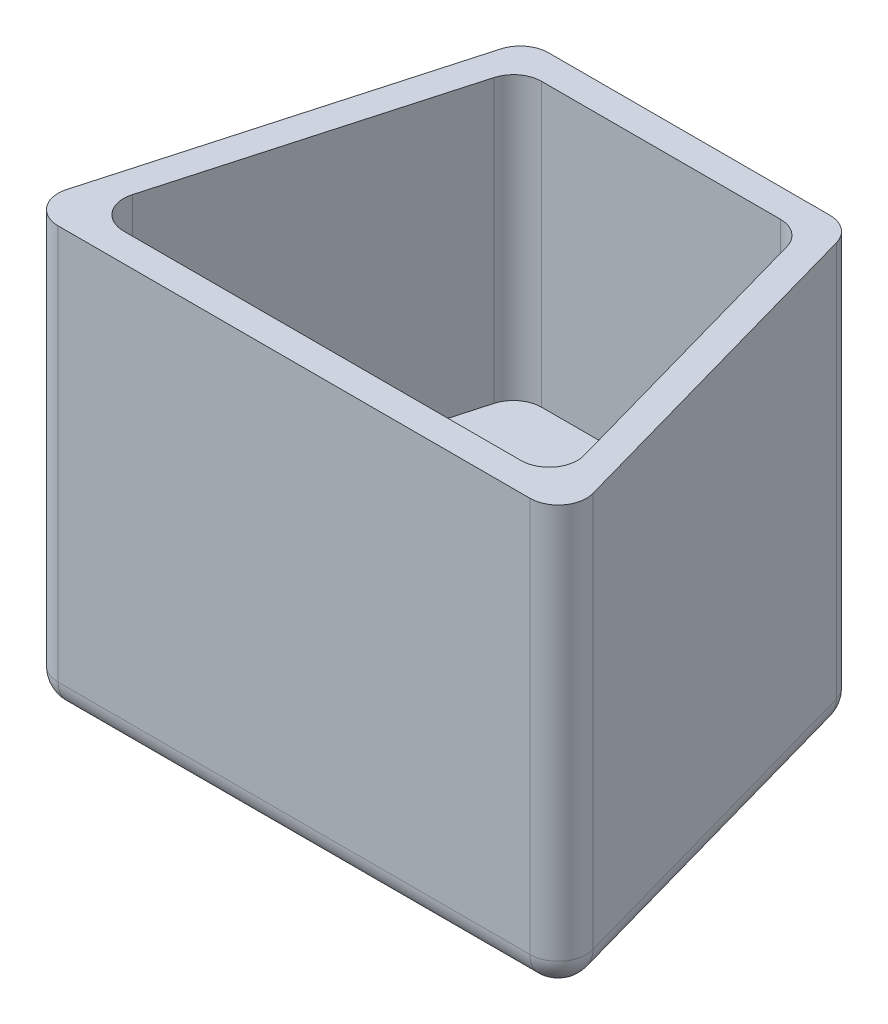
ISO-10303-21;
HEADER;
FILE_DESCRIPTION(('STEP AP214'),'2;1');
FILE_NAME('part.step','',(''),(''),'','','');
FILE_SCHEMA(('AUTOMOTIVE_DESIGN { 1 0 10303 214 1 1 1 1 }'));
ENDSEC;
DATA;
#1=APPLICATION_CONTEXT('core data for automotive mechanical design processes');
#2=APPLICATION_PROTOCOL_DEFINITION('international standard','automotive_design',2000,#1);
#3=PRODUCT_CONTEXT('',#1,'mechanical');
#4=PRODUCT('Part','Part','',(#3));
#5=PRODUCT_RELATED_PRODUCT_CATEGORY('part','',(#4));
#6=PRODUCT_DEFINITION_FORMATION('','',#4);
#7=PRODUCT_DEFINITION_CONTEXT('part definition',#1,'design');
#8=PRODUCT_DEFINITION('design','',#6,#7);
#9=PRODUCT_DEFINITION_SHAPE('','',#8);
#10=(LENGTH_UNIT() NAMED_UNIT(*) SI_UNIT(.MILLI.,.METRE.));
#11=(NAMED_UNIT(*) PLANE_ANGLE_UNIT() SI_UNIT($,.RADIAN.));
#12=(NAMED_UNIT(*) SI_UNIT($,.STERADIAN.) SOLID_ANGLE_UNIT());
#13=UNCERTAINTY_MEASURE_WITH_UNIT(LENGTH_MEASURE(1.E-05),#10,'distance_accuracy_value','');
#14=(GEOMETRIC_REPRESENTATION_CONTEXT(3) GLOBAL_UNCERTAINTY_ASSIGNED_CONTEXT((#13)) GLOBAL_UNIT_ASSIGNED_CONTEXT((#10,
#11,#12)) REPRESENTATION_CONTEXT('',''));
#15=CARTESIAN_POINT('',(0.,0.,0.));
#16=DIRECTION('',(0.,0.,1.));
#17=DIRECTION('',(1.,0.,0.));
#18=AXIS2_PLACEMENT_3D('',#15,#16,#17);
#19=CARTESIAN_POINT('',(-7.0398555990135,15.,5.));
#20=DIRECTION('',(0.,-1.,0.));
#21=DIRECTION('',(0.,0.,-1.));
#22=AXIS2_PLACEMENT_3D('',#19,#20,#21);
#23=CYLINDRICAL_SURFACE('',#22,1.);
#24=DIRECTION('',(0.,-1.,0.));
#25=VECTOR('',#24,1.);
#26=CARTESIAN_POINT('',(-7.03985559901349,15.,6.));
#27=LINE('',#26,#25);
#28=CARTESIAN_POINT('',(-7.03985559901349,15.,6.));
#29=VERTEX_POINT('',#28);
#30=CARTESIAN_POINT('',(-7.03985559901349,5.,6.));
#31=VERTEX_POINT('',#30);
#32=EDGE_CURVE('E185',#29,#31,#27,.T.);
#33=ORIENTED_EDGE('',*,*,#32,.T.);
#34=CARTESIAN_POINT('',(-7.0398555990135,5.,5.));
#35=DIRECTION('',(0.,-1.,0.));
#36=DIRECTION('',(0.,0.,-1.));
#37=AXIS2_PLACEMENT_3D('',#34,#35,#36);
#38=CIRCLE('',#37,1.);
#39=CARTESIAN_POINT('',(-8.0025065391674,5.,4.72925442308171));
#40=VERTEX_POINT('',#39);
#41=EDGE_CURVE('E167',#31,#40,#38,.T.);
#42=ORIENTED_EDGE('',*,*,#41,.T.);
#43=DIRECTION('',(0.,-1.,0.));
#44=VECTOR('',#43,1.);
#45=CARTESIAN_POINT('',(-8.0025065391674,15.,4.72925442308171));
#46=LINE('',#45,#44);
#47=CARTESIAN_POINT('',(-8.0025065391674,15.,4.72925442308171));
#48=VERTEX_POINT('',#47);
#49=EDGE_CURVE('E176',#48,#40,#46,.T.);
#50=ORIENTED_EDGE('',*,*,#49,.F.);
#51=CARTESIAN_POINT('',(-7.0398555990135,15.,5.));
#52=DIRECTION('',(0.,1.,0.));
#53=DIRECTION('',(0.,0.,1.));
#54=AXIS2_PLACEMENT_3D('',#51,#52,#53);
#55=CIRCLE('',#54,1.);
#56=EDGE_CURVE('E181',#48,#29,#55,.T.);
#57=ORIENTED_EDGE('',*,*,#56,.T.);
#58=EDGE_LOOP('',(#33,#42,#50,#57));
#59=FACE_BOUND('',#58,.T.);
#60=ADVANCED_FACE('F40',(#59),#23,.F.);
#61=CARTESIAN_POINT('',(-7.03985559901349,15.,6.));
#62=DIRECTION('',(0.,0.,-1.));
#63=DIRECTION('',(-1.,0.,0.));
#64=AXIS2_PLACEMENT_3D('',#61,#62,#63);
#65=PLANE('',#64);
#66=DIRECTION('',(0.,-1.,0.));
#67=VECTOR('',#66,1.);
#68=CARTESIAN_POINT('',(7.03985559901349,15.,6.));
#69=LINE('',#68,#67);
#70=CARTESIAN_POINT('',(7.03985559901349,15.,6.));
#71=VERTEX_POINT('',#70);
#72=CARTESIAN_POINT('',(7.03985559901349,5.,6.));
#73=VERTEX_POINT('',#72);
#74=EDGE_CURVE('E208',#71,#73,#69,.T.);
#75=ORIENTED_EDGE('',*,*,#74,.T.);
#76=DIRECTION('',(-1.,0.,0.));
#77=VECTOR('',#76,1.);
#78=CARTESIAN_POINT('',(-7.03985559901349,5.,6.));
#79=LINE('',#78,#77);
#80=EDGE_CURVE('E184',#73,#31,#79,.T.);
#81=ORIENTED_EDGE('',*,*,#80,.T.);
#82=ORIENTED_EDGE('',*,*,#32,.F.);
#83=DIRECTION('',(1.,0.,0.));
#84=VECTOR('',#83,1.);
#85=CARTESIAN_POINT('',(-7.03985559901349,15.,6.));
#86=LINE('',#85,#84);
#87=EDGE_CURVE('E312',#29,#71,#86,.T.);
#88=ORIENTED_EDGE('',*,*,#87,.T.);
#89=EDGE_LOOP('',(#75,#81,#82,#88));
#90=FACE_BOUND('',#89,.T.);
#91=ADVANCED_FACE('F334',(#90),#65,.T.);
#92=CARTESIAN_POINT('',(7.0398555990135,15.,5.));
#93=DIRECTION('',(0.,-1.,0.));
#94=DIRECTION('',(0.,0.,-1.));
#95=AXIS2_PLACEMENT_3D('',#92,#93,#94);
#96=CYLINDRICAL_SURFACE('',#95,1.);
#97=DIRECTION('',(0.,-1.,0.));
#98=VECTOR('',#97,1.);
#99=CARTESIAN_POINT('',(8.0025065391674,15.,4.72925442308171));
#100=LINE('',#99,#98);
#101=CARTESIAN_POINT('',(8.0025065391674,15.,4.72925442308171));
#102=VERTEX_POINT('',#101);
#103=CARTESIAN_POINT('',(8.0025065391674,5.,4.72925442308171));
#104=VERTEX_POINT('',#103);
#105=EDGE_CURVE('E202',#102,#104,#100,.T.);
#106=ORIENTED_EDGE('',*,*,#105,.T.);
#107=CARTESIAN_POINT('',(7.0398555990135,5.,5.));
#108=DIRECTION('',(0.,-1.,0.));
#109=DIRECTION('',(0.,0.,-1.));
#110=AXIS2_PLACEMENT_3D('',#107,#108,#109);
#111=CIRCLE('',#110,1.);
#112=EDGE_CURVE('E309',#104,#73,#111,.T.);
#113=ORIENTED_EDGE('',*,*,#112,.T.);
#114=ORIENTED_EDGE('',*,*,#74,.F.);
#115=CARTESIAN_POINT('',(7.0398555990135,15.,5.));
#116=DIRECTION('',(0.,1.,0.));
#117=DIRECTION('',(0.,0.,-1.));
#118=AXIS2_PLACEMENT_3D('',#115,#116,#117);
#119=CIRCLE('',#118,1.);
#120=EDGE_CURVE('E320',#71,#102,#119,.T.);
#121=ORIENTED_EDGE('',*,*,#120,.T.);
#122=EDGE_LOOP('',(#106,#113,#114,#121));
#123=FACE_BOUND('',#122,.T.);
#124=ADVANCED_FACE('F336',(#123),#96,.F.);
#125=CARTESIAN_POINT('',(5.1900065391674,15.,-5.27074557691828));
#126=DIRECTION('',(-0.962650940153899,0.,0.270745576918284));
#127=DIRECTION('',(0.270745576918284,0.,0.962650940153899));
#128=AXIS2_PLACEMENT_3D('',#125,#126,#127);
#129=PLANE('',#128);
#130=DIRECTION('',(0.,-1.,0.));
#131=VECTOR('',#130,1.);
#132=CARTESIAN_POINT('',(5.1900065391674,15.,-5.27074557691828));
#133=LINE('',#132,#131);
#134=CARTESIAN_POINT('',(5.1900065391674,15.,-5.27074557691828));
#135=VERTEX_POINT('',#134);
#136=CARTESIAN_POINT('',(5.1900065391674,5.,-5.27074557691828));
#137=VERTEX_POINT('',#136);
#138=EDGE_CURVE('E205',#135,#137,#133,.T.);
#139=ORIENTED_EDGE('',*,*,#138,.T.);
#140=DIRECTION('',(0.270745576918284,0.,0.962650940153899));
#141=VECTOR('',#140,1.);
#142=CARTESIAN_POINT('',(5.1900065391674,5.,-5.27074557691828));
#143=LINE('',#142,#141);
#144=EDGE_CURVE('E307',#137,#104,#143,.T.);
#145=ORIENTED_EDGE('',*,*,#144,.T.);
#146=ORIENTED_EDGE('',*,*,#105,.F.);
#147=DIRECTION('',(-0.270745576918284,0.,-0.962650940153899));
#148=VECTOR('',#147,1.);
#149=CARTESIAN_POINT('',(5.1900065391674,15.,-5.27074557691828));
#150=LINE('',#149,#148);
#151=EDGE_CURVE('E317',#102,#135,#150,.T.);
#152=ORIENTED_EDGE('',*,*,#151,.T.);
#153=EDGE_LOOP('',(#139,#145,#146,#152));
#154=FACE_BOUND('',#153,.T.);
#155=ADVANCED_FACE('F339',(#154),#129,.T.);
#156=CARTESIAN_POINT('',(4.2273555990135,15.,-5.));
#157=DIRECTION('',(0.,-1.,0.));
#158=DIRECTION('',(0.,0.,-1.));
#159=AXIS2_PLACEMENT_3D('',#156,#157,#158);
#160=CYLINDRICAL_SURFACE('',#159,1.);
#161=DIRECTION('',(0.,-1.,0.));
#162=VECTOR('',#161,1.);
#163=CARTESIAN_POINT('',(4.22735559901349,15.,-6.));
#164=LINE('',#163,#162);
#165=CARTESIAN_POINT('',(4.22735559901349,15.,-6.));
#166=VERTEX_POINT('',#165);
#167=CARTESIAN_POINT('',(4.22735559901349,5.,-6.));
#168=VERTEX_POINT('',#167);
#169=EDGE_CURVE('E200',#166,#168,#164,.T.);
#170=ORIENTED_EDGE('',*,*,#169,.T.);
#171=CARTESIAN_POINT('',(4.2273555990135,5.,-5.));
#172=DIRECTION('',(0.,-1.,0.));
#173=DIRECTION('',(0.,0.,-1.));
#174=AXIS2_PLACEMENT_3D('',#171,#172,#173);
#175=CIRCLE('',#174,1.);
#176=EDGE_CURVE('E305',#168,#137,#175,.T.);
#177=ORIENTED_EDGE('',*,*,#176,.T.);
#178=ORIENTED_EDGE('',*,*,#138,.F.);
#179=CARTESIAN_POINT('',(4.2273555990135,15.,-5.));
#180=DIRECTION('',(0.,1.,0.));
#181=DIRECTION('',(0.,0.,1.));
#182=AXIS2_PLACEMENT_3D('',#179,#180,#181);
#183=CIRCLE('',#182,1.);
#184=EDGE_CURVE('E321',#135,#166,#183,.T.);
#185=ORIENTED_EDGE('',*,*,#184,.T.);
#186=EDGE_LOOP('',(#170,#177,#178,#185));
#187=FACE_BOUND('',#186,.T.);
#188=ADVANCED_FACE('F343',(#187),#160,.F.);
#189=CARTESIAN_POINT('',(-4.22735559901349,15.,-6.));
#190=DIRECTION('',(0.,0.,1.));
#191=DIRECTION('',(1.,0.,0.));
#192=AXIS2_PLACEMENT_3D('',#189,#190,#191);
#193=PLANE('',#192);
#194=DIRECTION('',(0.,-1.,0.));
#195=VECTOR('',#194,1.);
#196=CARTESIAN_POINT('',(-4.22735559901349,15.,-6.));
#197=LINE('',#196,#195);
#198=CARTESIAN_POINT('',(-4.22735559901349,15.,-6.));
#199=VERTEX_POINT('',#198);
#200=CARTESIAN_POINT('',(-4.2273555990135,5.,-6.));
#201=VERTEX_POINT('',#200);
#202=EDGE_CURVE('E192',#199,#201,#197,.T.);
#203=ORIENTED_EDGE('',*,*,#202,.T.);
#204=DIRECTION('',(1.,0.,0.));
#205=VECTOR('',#204,1.);
#206=CARTESIAN_POINT('',(-4.22735559901349,5.,-6.));
#207=LINE('',#206,#205);
#208=EDGE_CURVE('E300',#201,#168,#207,.T.);
#209=ORIENTED_EDGE('',*,*,#208,.T.);
#210=ORIENTED_EDGE('',*,*,#169,.F.);
#211=DIRECTION('',(-1.,0.,0.));
#212=VECTOR('',#211,1.);
#213=CARTESIAN_POINT('',(-4.22735559901349,15.,-6.));
#214=LINE('',#213,#212);
#215=EDGE_CURVE('E323',#166,#199,#214,.T.);
#216=ORIENTED_EDGE('',*,*,#215,.T.);
#217=EDGE_LOOP('',(#203,#209,#210,#216));
#218=FACE_BOUND('',#217,.T.);
#219=ADVANCED_FACE('F350',(#218),#193,.T.);
#220=CARTESIAN_POINT('',(-4.2273555990135,15.,-5.));
#221=DIRECTION('',(0.,-1.,0.));
#222=DIRECTION('',(0.,0.,-1.));
#223=AXIS2_PLACEMENT_3D('',#220,#221,#222);
#224=CYLINDRICAL_SURFACE('',#223,1.);
#225=DIRECTION('',(0.,-1.,0.));
#226=VECTOR('',#225,1.);
#227=CARTESIAN_POINT('',(-5.1900065391674,15.,-5.27074557691828));
#228=LINE('',#227,#226);
#229=CARTESIAN_POINT('',(-5.1900065391674,15.,-5.27074557691828));
#230=VERTEX_POINT('',#229);
#231=CARTESIAN_POINT('',(-5.1900065391674,5.,-5.27074557691828));
#232=VERTEX_POINT('',#231);
#233=EDGE_CURVE('E188',#230,#232,#228,.T.);
#234=ORIENTED_EDGE('',*,*,#233,.T.);
#235=CARTESIAN_POINT('',(-4.2273555990135,5.,-5.));
#236=DIRECTION('',(0.,-1.,0.));
#237=DIRECTION('',(0.,0.,-1.));
#238=AXIS2_PLACEMENT_3D('',#235,#236,#237);
#239=CIRCLE('',#238,1.);
#240=EDGE_CURVE('E166',#232,#201,#239,.T.);
#241=ORIENTED_EDGE('',*,*,#240,.T.);
#242=ORIENTED_EDGE('',*,*,#202,.F.);
#243=CARTESIAN_POINT('',(-4.2273555990135,15.,-5.));
#244=DIRECTION('',(0.,1.,0.));
#245=DIRECTION('',(0.,0.,1.));
#246=AXIS2_PLACEMENT_3D('',#243,#244,#245);
#247=CIRCLE('',#246,1.);
#248=EDGE_CURVE('E194',#199,#230,#247,.T.);
#249=ORIENTED_EDGE('',*,*,#248,.T.);
#250=EDGE_LOOP('',(#234,#241,#242,#249));
#251=FACE_BOUND('',#250,.T.);
#252=ADVANCED_FACE('F326',(#251),#224,.F.);
#253=CARTESIAN_POINT('',(-5.1900065391674,15.,-5.27074557691828));
#254=DIRECTION('',(0.962650940153899,0.,0.270745576918284));
#255=DIRECTION('',(0.270745576918284,0.,-0.962650940153899));
#256=AXIS2_PLACEMENT_3D('',#253,#254,#255);
#257=PLANE('',#256);
#258=ORIENTED_EDGE('',*,*,#49,.T.);
#259=DIRECTION('',(0.270745576918284,0.,-0.962650940153899));
#260=VECTOR('',#259,1.);
#261=CARTESIAN_POINT('',(-5.1900065391674,5.,-5.27074557691828));
#262=LINE('',#261,#260);
#263=EDGE_CURVE('E162',#40,#232,#262,.T.);
#264=ORIENTED_EDGE('',*,*,#263,.T.);
#265=ORIENTED_EDGE('',*,*,#233,.F.);
#266=DIRECTION('',(-0.270745576918284,0.,0.962650940153899));
#267=VECTOR('',#266,1.);
#268=CARTESIAN_POINT('',(-5.1900065391674,15.,-5.27074557691828));
#269=LINE('',#268,#267);
#270=EDGE_CURVE('E187',#230,#48,#269,.T.);
#271=ORIENTED_EDGE('',*,*,#270,.T.);
#272=EDGE_LOOP('',(#258,#264,#265,#271));
#273=FACE_BOUND('',#272,.T.);
#274=ADVANCED_FACE('F186',(#273),#257,.T.);
#275=CARTESIAN_POINT('',(-8.35990373267567,15.,6.));
#276=DIRECTION('',(0.,-1.,0.));
#277=DIRECTION('',(0.,0.,-1.));
#278=AXIS2_PLACEMENT_3D('',#275,#276,#277);
#279=PLANE('',#278);
#280=CARTESIAN_POINT('',(-8.35990373267567,15.,6.));
#281=DIRECTION('',(0.,1.,0.));
#282=DIRECTION('',(0.,0.,-1.));
#283=AXIS2_PLACEMENT_3D('',#280,#281,#282);
#284=CIRCLE('',#283,1.);
#285=CARTESIAN_POINT('',(-9.32255467282957,15.,5.72925442308172));
#286=VERTEX_POINT('',#285);
#287=CARTESIAN_POINT('',(-8.35990373267567,15.,7.));
#288=VERTEX_POINT('',#287);
#289=EDGE_CURVE('E215',#286,#288,#284,.T.);
#290=ORIENTED_EDGE('',*,*,#289,.T.);
#291=DIRECTION('',(1.,0.,0.));
#292=VECTOR('',#291,1.);
#293=CARTESIAN_POINT('',(-8.35990373267567,15.,7.));
#294=LINE('',#293,#292);
#295=CARTESIAN_POINT('',(8.35990373267567,15.,7.));
#296=VERTEX_POINT('',#295);
#297=EDGE_CURVE('E214',#288,#296,#294,.T.);
#298=ORIENTED_EDGE('',*,*,#297,.T.);
#299=CARTESIAN_POINT('',(8.35990373267567,15.,6.));
#300=DIRECTION('',(0.,1.,0.));
#301=DIRECTION('',(0.,0.,1.));
#302=AXIS2_PLACEMENT_3D('',#299,#300,#301);
#303=CIRCLE('',#302,1.);
#304=CARTESIAN_POINT('',(9.32255467282956,15.,5.72925442308172));
#305=VERTEX_POINT('',#304);
#306=EDGE_CURVE('E220',#296,#305,#303,.T.);
#307=ORIENTED_EDGE('',*,*,#306,.T.);
#308=DIRECTION('',(-0.270745576918284,0.,-0.962650940153899));
#309=VECTOR('',#308,1.);
#310=CARTESIAN_POINT('',(5.94755467282956,15.,-6.27074557691828));
#311=LINE('',#310,#309);
#312=CARTESIAN_POINT('',(5.94755467282956,15.,-6.27074557691828));
#313=VERTEX_POINT('',#312);
#314=EDGE_CURVE('E218',#305,#313,#311,.T.);
#315=ORIENTED_EDGE('',*,*,#314,.T.);
#316=CARTESIAN_POINT('',(4.98490373267567,15.,-6.));
#317=DIRECTION('',(0.,1.,0.));
#318=DIRECTION('',(0.,0.,-1.));
#319=AXIS2_PLACEMENT_3D('',#316,#317,#318);
#320=CIRCLE('',#319,0.999999999999998);
#321=CARTESIAN_POINT('',(4.98490373267567,15.,-7.));
#322=VERTEX_POINT('',#321);
#323=EDGE_CURVE('E222',#313,#322,#320,.T.);
#324=ORIENTED_EDGE('',*,*,#323,.T.);
#325=DIRECTION('',(-1.,0.,0.));
#326=VECTOR('',#325,1.);
#327=CARTESIAN_POINT('',(-4.98490373267567,15.,-7.));
#328=LINE('',#327,#326);
#329=CARTESIAN_POINT('',(-4.98490373267567,15.,-7.));
#330=VERTEX_POINT('',#329);
#331=EDGE_CURVE('E224',#322,#330,#328,.T.);
#332=ORIENTED_EDGE('',*,*,#331,.T.);
#333=CARTESIAN_POINT('',(-4.98490373267567,15.,-6.));
#334=DIRECTION('',(0.,1.,0.));
#335=DIRECTION('',(0.,0.,1.));
#336=AXIS2_PLACEMENT_3D('',#333,#334,#335);
#337=CIRCLE('',#336,0.999999999999999);
#338=CARTESIAN_POINT('',(-5.94755467282956,15.,-6.27074557691828));
#339=VERTEX_POINT('',#338);
#340=EDGE_CURVE('E223',#330,#339,#337,.T.);
#341=ORIENTED_EDGE('',*,*,#340,.T.);
#342=DIRECTION('',(-0.270745576918284,0.,0.962650940153899));
#343=VECTOR('',#342,1.);
#344=CARTESIAN_POINT('',(-5.94755467282956,15.,-6.27074557691828));
#345=LINE('',#344,#343);
#346=EDGE_CURVE('E230',#339,#286,#345,.T.);
#347=ORIENTED_EDGE('',*,*,#346,.T.);
#348=EDGE_LOOP('',(#290,#298,#307,#315,#324,#332,#341,#347));
#349=FACE_BOUND('',#348,.T.);
#350=ORIENTED_EDGE('',*,*,#56,.F.);
#351=ORIENTED_EDGE('',*,*,#270,.F.);
#352=ORIENTED_EDGE('',*,*,#248,.F.);
#353=ORIENTED_EDGE('',*,*,#215,.F.);
#354=ORIENTED_EDGE('',*,*,#184,.F.);
#355=ORIENTED_EDGE('',*,*,#151,.F.);
#356=ORIENTED_EDGE('',*,*,#120,.F.);
#357=ORIENTED_EDGE('',*,*,#87,.F.);
#358=EDGE_LOOP('',(#350,#351,#352,#353,#354,#355,#356,#357));
#359=FACE_BOUND('',#358,.T.);
#360=ADVANCED_FACE('F328',(#349,#359),#279,.F.);
#361=CARTESIAN_POINT('',(-8.35990373267567,0.,6.));
#362=DIRECTION('',(0.,-1.,0.));
#363=DIRECTION('',(0.,0.,-1.));
#364=AXIS2_PLACEMENT_3D('',#361,#362,#363);
#365=PLANE('',#364);
#366=DIRECTION('',(1.,0.,0.));
#367=VECTOR('',#366,1.);
#368=CARTESIAN_POINT('',(-8.35990373267567,0.,6.));
#369=LINE('',#368,#367);
#370=CARTESIAN_POINT('',(8.35990373267567,0.,6.));
#371=VERTEX_POINT('',#370);
#372=CARTESIAN_POINT('',(-8.35990373267567,0.,6.));
#373=VERTEX_POINT('',#372);
#374=EDGE_CURVE('E251',#371,#373,#369,.F.);
#375=ORIENTED_EDGE('',*,*,#374,.T.);
#376=DIRECTION('',(-0.270745576918284,0.,0.962650940153899));
#377=VECTOR('',#376,1.);
#378=CARTESIAN_POINT('',(-4.98490373267566,0.,-6.));
#379=LINE('',#378,#377);
#380=CARTESIAN_POINT('',(-4.98490373267567,0.,-6.));
#381=VERTEX_POINT('',#380);
#382=EDGE_CURVE('E259',#373,#381,#379,.F.);
#383=ORIENTED_EDGE('',*,*,#382,.T.);
#384=DIRECTION('',(-1.,0.,0.));
#385=VECTOR('',#384,1.);
#386=CARTESIAN_POINT('',(4.98490373267567,0.,-6.));
#387=LINE('',#386,#385);
#388=CARTESIAN_POINT('',(4.98490373267566,0.,-6.));
#389=VERTEX_POINT('',#388);
#390=EDGE_CURVE('E260',#381,#389,#387,.F.);
#391=ORIENTED_EDGE('',*,*,#390,.T.);
#392=DIRECTION('',(-0.270745576918284,0.,-0.962650940153899));
#393=VECTOR('',#392,1.);
#394=CARTESIAN_POINT('',(8.35990373267567,0.,6.00000000000001));
#395=LINE('',#394,#393);
#396=EDGE_CURVE('E254',#389,#371,#395,.F.);
#397=ORIENTED_EDGE('',*,*,#396,.T.);
#398=EDGE_LOOP('',(#375,#383,#391,#397));
#399=FACE_BOUND('',#398,.T.);
#400=ADVANCED_FACE('F368',(#399),#365,.T.);
#401=CARTESIAN_POINT('',(-8.35990373267567,15.,6.));
#402=DIRECTION('',(0.,-1.,0.));
#403=DIRECTION('',(0.,0.,-1.));
#404=AXIS2_PLACEMENT_3D('',#401,#402,#403);
#405=CYLINDRICAL_SURFACE('',#404,1.);
#406=DIRECTION('',(0.,-1.,0.));
#407=VECTOR('',#406,1.);
#408=CARTESIAN_POINT('',(-9.32255467282957,15.,5.72925442308172));
#409=LINE('',#408,#407);
#410=CARTESIAN_POINT('',(-9.32255467282957,1.,5.72925442308172));
#411=VERTEX_POINT('',#410);
#412=EDGE_CURVE('E228',#286,#411,#409,.T.);
#413=ORIENTED_EDGE('',*,*,#412,.T.);
#414=CARTESIAN_POINT('',(-8.35990373267567,1.,6.));
#415=DIRECTION('',(0.,-1.,0.));
#416=DIRECTION('',(0.,0.,-1.));
#417=AXIS2_PLACEMENT_3D('',#414,#415,#416);
#418=CIRCLE('',#417,1.);
#419=CARTESIAN_POINT('',(-8.35990373267567,1.,7.));
#420=VERTEX_POINT('',#419);
#421=EDGE_CURVE('E172',#411,#420,#418,.F.);
#422=ORIENTED_EDGE('',*,*,#421,.T.);
#423=DIRECTION('',(0.,-1.,0.));
#424=VECTOR('',#423,1.);
#425=CARTESIAN_POINT('',(-8.35990373267567,15.,7.));
#426=LINE('',#425,#424);
#427=EDGE_CURVE('E173',#288,#420,#426,.T.);
#428=ORIENTED_EDGE('',*,*,#427,.F.);
#429=ORIENTED_EDGE('',*,*,#289,.F.);
#430=EDGE_LOOP('',(#413,#422,#428,#429));
#431=FACE_BOUND('',#430,.T.);
#432=ADVANCED_FACE('F367',(#431),#405,.T.);
#433=CARTESIAN_POINT('',(-8.35990373267567,15.,7.));
#434=DIRECTION('',(0.,0.,-1.));
#435=DIRECTION('',(-1.,0.,0.));
#436=AXIS2_PLACEMENT_3D('',#433,#434,#435);
#437=PLANE('',#436);
#438=ORIENTED_EDGE('',*,*,#427,.T.);
#439=DIRECTION('',(1.,0.,0.));
#440=VECTOR('',#439,1.);
#441=CARTESIAN_POINT('',(8.35990373267567,1.,7.));
#442=LINE('',#441,#440);
#443=CARTESIAN_POINT('',(8.35990373267567,1.,7.));
#444=VERTEX_POINT('',#443);
#445=EDGE_CURVE('E11',#420,#444,#442,.T.);
#446=ORIENTED_EDGE('',*,*,#445,.T.);
#447=DIRECTION('',(0.,-1.,0.));
#448=VECTOR('',#447,1.);
#449=CARTESIAN_POINT('',(8.35990373267567,15.,7.));
#450=LINE('',#449,#448);
#451=EDGE_CURVE('E247',#296,#444,#450,.T.);
#452=ORIENTED_EDGE('',*,*,#451,.F.);
#453=ORIENTED_EDGE('',*,*,#297,.F.);
#454=EDGE_LOOP('',(#438,#446,#452,#453));
#455=FACE_BOUND('',#454,.T.);
#456=ADVANCED_FACE('F394',(#455),#437,.F.);
#457=CARTESIAN_POINT('',(8.35990373267567,15.,6.));
#458=DIRECTION('',(0.,-1.,0.));
#459=DIRECTION('',(0.,0.,-1.));
#460=AXIS2_PLACEMENT_3D('',#457,#458,#459);
#461=CYLINDRICAL_SURFACE('',#460,1.);
#462=ORIENTED_EDGE('',*,*,#451,.T.);
#463=CARTESIAN_POINT('',(8.35990373267567,1.,6.));
#464=DIRECTION('',(0.,-1.,0.));
#465=DIRECTION('',(0.,0.,-1.));
#466=AXIS2_PLACEMENT_3D('',#463,#464,#465);
#467=CIRCLE('',#466,1.);
#468=CARTESIAN_POINT('',(9.32255467282956,1.,5.72925442308172));
#469=VERTEX_POINT('',#468);
#470=EDGE_CURVE('E46',#444,#469,#467,.F.);
#471=ORIENTED_EDGE('',*,*,#470,.T.);
#472=DIRECTION('',(0.,-1.,0.));
#473=VECTOR('',#472,1.);
#474=CARTESIAN_POINT('',(9.32255467282956,15.,5.72925442308172));
#475=LINE('',#474,#473);
#476=EDGE_CURVE('E243',#305,#469,#475,.T.);
#477=ORIENTED_EDGE('',*,*,#476,.F.);
#478=ORIENTED_EDGE('',*,*,#306,.F.);
#479=EDGE_LOOP('',(#462,#471,#477,#478));
#480=FACE_BOUND('',#479,.T.);
#481=ADVANCED_FACE('F391',(#480),#461,.T.);
#482=CARTESIAN_POINT('',(5.94755467282956,15.,-6.27074557691828));
#483=DIRECTION('',(-0.962650940153899,0.,0.270745576918284));
#484=DIRECTION('',(0.270745576918284,0.,0.962650940153899));
#485=AXIS2_PLACEMENT_3D('',#482,#483,#484);
#486=PLANE('',#485);
#487=ORIENTED_EDGE('',*,*,#476,.T.);
#488=DIRECTION('',(-0.270745576918284,0.,-0.962650940153899));
#489=VECTOR('',#488,1.);
#490=CARTESIAN_POINT('',(5.94755467282956,1.,-6.27074557691828));
#491=LINE('',#490,#489);
#492=CARTESIAN_POINT('',(5.94755467282956,1.,-6.27074557691828));
#493=VERTEX_POINT('',#492);
#494=EDGE_CURVE('E268',#469,#493,#491,.T.);
#495=ORIENTED_EDGE('',*,*,#494,.T.);
#496=DIRECTION('',(0.,-1.,0.));
#497=VECTOR('',#496,1.);
#498=CARTESIAN_POINT('',(5.94755467282956,15.,-6.27074557691828));
#499=LINE('',#498,#497);
#500=EDGE_CURVE('E241',#313,#493,#499,.T.);
#501=ORIENTED_EDGE('',*,*,#500,.F.);
#502=ORIENTED_EDGE('',*,*,#314,.F.);
#503=EDGE_LOOP('',(#487,#495,#501,#502));
#504=FACE_BOUND('',#503,.T.);
#505=ADVANCED_FACE('F390',(#504),#486,.F.);
#506=CARTESIAN_POINT('',(4.98490373267567,15.,-6.));
#507=DIRECTION('',(0.,-1.,0.));
#508=DIRECTION('',(0.,0.,-1.));
#509=AXIS2_PLACEMENT_3D('',#506,#507,#508);
#510=CYLINDRICAL_SURFACE('',#509,0.999999999999998);
#511=ORIENTED_EDGE('',*,*,#500,.T.);
#512=CARTESIAN_POINT('',(4.98490373267567,1.,-6.));
#513=DIRECTION('',(0.,-1.,0.));
#514=DIRECTION('',(0.,0.,-1.));
#515=AXIS2_PLACEMENT_3D('',#512,#513,#514);
#516=CIRCLE('',#515,0.999999999999998);
#517=CARTESIAN_POINT('',(4.98490373267567,1.,-7.));
#518=VERTEX_POINT('',#517);
#519=EDGE_CURVE('E266',#493,#518,#516,.F.);
#520=ORIENTED_EDGE('',*,*,#519,.T.);
#521=DIRECTION('',(0.,-1.,0.));
#522=VECTOR('',#521,1.);
#523=CARTESIAN_POINT('',(4.98490373267567,15.,-7.));
#524=LINE('',#523,#522);
#525=EDGE_CURVE('E236',#322,#518,#524,.T.);
#526=ORIENTED_EDGE('',*,*,#525,.F.);
#527=ORIENTED_EDGE('',*,*,#323,.F.);
#528=EDGE_LOOP('',(#511,#520,#526,#527));
#529=FACE_BOUND('',#528,.T.);
#530=ADVANCED_FACE('F382',(#529),#510,.T.);
#531=CARTESIAN_POINT('',(-4.98490373267567,15.,-7.));
#532=DIRECTION('',(0.,0.,1.));
#533=DIRECTION('',(1.,0.,0.));
#534=AXIS2_PLACEMENT_3D('',#531,#532,#533);
#535=PLANE('',#534);
#536=ORIENTED_EDGE('',*,*,#525,.T.);
#537=DIRECTION('',(-1.,0.,0.));
#538=VECTOR('',#537,1.);
#539=CARTESIAN_POINT('',(-4.98490373267567,1.,-7.));
#540=LINE('',#539,#538);
#541=CARTESIAN_POINT('',(-4.98490373267567,1.,-7.));
#542=VERTEX_POINT('',#541);
#543=EDGE_CURVE('E262',#518,#542,#540,.T.);
#544=ORIENTED_EDGE('',*,*,#543,.T.);
#545=DIRECTION('',(0.,-1.,0.));
#546=VECTOR('',#545,1.);
#547=CARTESIAN_POINT('',(-4.98490373267567,15.,-7.));
#548=LINE('',#547,#546);
#549=EDGE_CURVE('E233',#330,#542,#548,.T.);
#550=ORIENTED_EDGE('',*,*,#549,.F.);
#551=ORIENTED_EDGE('',*,*,#331,.F.);
#552=EDGE_LOOP('',(#536,#544,#550,#551));
#553=FACE_BOUND('',#552,.T.);
#554=ADVANCED_FACE('F377',(#553),#535,.F.);
#555=CARTESIAN_POINT('',(-4.98490373267567,15.,-6.));
#556=DIRECTION('',(0.,-1.,0.));
#557=DIRECTION('',(0.,0.,-1.));
#558=AXIS2_PLACEMENT_3D('',#555,#556,#557);
#559=CYLINDRICAL_SURFACE('',#558,0.999999999999999);
#560=ORIENTED_EDGE('',*,*,#549,.T.);
#561=CARTESIAN_POINT('',(-4.98490373267567,1.,-6.));
#562=DIRECTION('',(0.,-1.,0.));
#563=DIRECTION('',(0.,0.,-1.));
#564=AXIS2_PLACEMENT_3D('',#561,#562,#563);
#565=CIRCLE('',#564,0.999999999999999);
#566=CARTESIAN_POINT('',(-5.94755467282956,1.,-6.27074557691828));
#567=VERTEX_POINT('',#566);
#568=EDGE_CURVE('E265',#542,#567,#565,.F.);
#569=ORIENTED_EDGE('',*,*,#568,.T.);
#570=DIRECTION('',(0.,-1.,0.));
#571=VECTOR('',#570,1.);
#572=CARTESIAN_POINT('',(-5.94755467282956,15.,-6.27074557691828));
#573=LINE('',#572,#571);
#574=EDGE_CURVE('E235',#339,#567,#573,.T.);
#575=ORIENTED_EDGE('',*,*,#574,.F.);
#576=ORIENTED_EDGE('',*,*,#340,.F.);
#577=EDGE_LOOP('',(#560,#569,#575,#576));
#578=FACE_BOUND('',#577,.T.);
#579=ADVANCED_FACE('F374',(#578),#559,.T.);
#580=CARTESIAN_POINT('',(-5.94755467282956,15.,-6.27074557691828));
#581=DIRECTION('',(0.962650940153899,0.,0.270745576918284));
#582=DIRECTION('',(0.270745576918284,0.,-0.962650940153899));
#583=AXIS2_PLACEMENT_3D('',#580,#581,#582);
#584=PLANE('',#583);
#585=ORIENTED_EDGE('',*,*,#574,.T.);
#586=DIRECTION('',(-0.270745576918284,0.,0.962650940153899));
#587=VECTOR('',#586,1.);
#588=CARTESIAN_POINT('',(-9.32255467282957,1.,5.72925442308173));
#589=LINE('',#588,#587);
#590=EDGE_CURVE('E253',#567,#411,#589,.T.);
#591=ORIENTED_EDGE('',*,*,#590,.T.);
#592=ORIENTED_EDGE('',*,*,#412,.F.);
#593=ORIENTED_EDGE('',*,*,#346,.F.);
#594=EDGE_LOOP('',(#585,#591,#592,#593));
#595=FACE_BOUND('',#594,.T.);
#596=ADVANCED_FACE('F375',(#595),#584,.F.);
#597=CARTESIAN_POINT('',(-8.35990373267567,5.,6.));
#598=DIRECTION('',(0.,-1.,0.));
#599=DIRECTION('',(0.,0.,-1.));
#600=AXIS2_PLACEMENT_3D('',#597,#598,#599);
#601=PLANE('',#600);
#602=ORIENTED_EDGE('',*,*,#41,.F.);
#603=ORIENTED_EDGE('',*,*,#80,.F.);
#604=ORIENTED_EDGE('',*,*,#112,.F.);
#605=ORIENTED_EDGE('',*,*,#144,.F.);
#606=ORIENTED_EDGE('',*,*,#176,.F.);
#607=ORIENTED_EDGE('',*,*,#208,.F.);
#608=ORIENTED_EDGE('',*,*,#240,.F.);
#609=ORIENTED_EDGE('',*,*,#263,.F.);
#610=EDGE_LOOP('',(#602,#603,#604,#605,#606,#607,#608,#609));
#611=FACE_BOUND('',#610,.T.);
#612=ADVANCED_FACE('F164',(#611),#601,.F.);
#613=CARTESIAN_POINT('',(4.98490373267567,1.,-6.));
#614=DIRECTION('',(0.,-1.,0.));
#615=DIRECTION('',(0.,0.,-1.));
#616=AXIS2_PLACEMENT_3D('',#613,#614,#615);
#617=SPHERICAL_SURFACE('',#616,1.);
#618=CARTESIAN_POINT('',(4.98490373267567,1.,-6.));
#619=DIRECTION('',(0.270745576918282,0.,0.9626509401539));
#620=DIRECTION('',(0.9626509401539,0.,-0.270745576918282));
#621=AXIS2_PLACEMENT_3D('',#618,#619,#620);
#622=CIRCLE('',#621,1.);
#623=EDGE_CURVE('E287',#389,#493,#622,.T.);
#624=ORIENTED_EDGE('',*,*,#623,.F.);
#625=CARTESIAN_POINT('',(4.98490373267567,1.,-6.));
#626=DIRECTION('',(-1.,0.,0.));
#627=DIRECTION('',(0.,0.,1.));
#628=AXIS2_PLACEMENT_3D('',#625,#626,#627);
#629=CIRCLE('',#628,1.);
#630=EDGE_CURVE('E41',#518,#389,#629,.T.);
#631=ORIENTED_EDGE('',*,*,#630,.F.);
#632=ORIENTED_EDGE('',*,*,#519,.F.);
#633=EDGE_LOOP('',(#624,#631,#632));
#634=FACE_BOUND('',#633,.T.);
#635=ADVANCED_FACE('F39',(#634),#617,.T.);
#636=CARTESIAN_POINT('',(-4.98490373267567,1.,-6.));
#637=DIRECTION('',(1.,0.,0.));
#638=DIRECTION('',(0.,0.,-1.));
#639=AXIS2_PLACEMENT_3D('',#636,#637,#638);
#640=CYLINDRICAL_SURFACE('',#639,1.);
#641=ORIENTED_EDGE('',*,*,#630,.T.);
#642=ORIENTED_EDGE('',*,*,#390,.F.);
#643=CARTESIAN_POINT('',(-4.98490373267567,1.,-6.));
#644=DIRECTION('',(-1.,0.,0.));
#645=DIRECTION('',(0.,0.,1.));
#646=AXIS2_PLACEMENT_3D('',#643,#644,#645);
#647=CIRCLE('',#646,1.);
#648=EDGE_CURVE('E283',#542,#381,#647,.T.);
#649=ORIENTED_EDGE('',*,*,#648,.F.);
#650=ORIENTED_EDGE('',*,*,#543,.F.);
#651=EDGE_LOOP('',(#641,#642,#649,#650));
#652=FACE_BOUND('',#651,.T.);
#653=ADVANCED_FACE('F421',(#652),#640,.T.);
#654=CARTESIAN_POINT('',(4.98490373267566,1.,-6.));
#655=DIRECTION('',(0.270745576918284,0.,0.962650940153899));
#656=DIRECTION('',(0.962650940153899,0.,-0.270745576918284));
#657=AXIS2_PLACEMENT_3D('',#654,#655,#656);
#658=CYLINDRICAL_SURFACE('',#657,1.);
#659=ORIENTED_EDGE('',*,*,#623,.T.);
#660=ORIENTED_EDGE('',*,*,#494,.F.);
#661=CARTESIAN_POINT('',(8.35990373267567,1.,6.));
#662=DIRECTION('',(0.270745576918284,0.,0.962650940153899));
#663=DIRECTION('',(0.962650940153899,0.,-0.270745576918284));
#664=AXIS2_PLACEMENT_3D('',#661,#662,#663);
#665=CIRCLE('',#664,1.);
#666=EDGE_CURVE('E281',#371,#469,#665,.T.);
#667=ORIENTED_EDGE('',*,*,#666,.F.);
#668=ORIENTED_EDGE('',*,*,#396,.F.);
#669=EDGE_LOOP('',(#659,#660,#667,#668));
#670=FACE_BOUND('',#669,.T.);
#671=ADVANCED_FACE('F419',(#670),#658,.T.);
#672=CARTESIAN_POINT('',(-4.98490373267567,1.,-6.));
#673=DIRECTION('',(0.,-1.,0.));
#674=DIRECTION('',(0.,0.,-1.));
#675=AXIS2_PLACEMENT_3D('',#672,#673,#674);
#676=SPHERICAL_SURFACE('',#675,1.);
#677=ORIENTED_EDGE('',*,*,#568,.F.);
#678=ORIENTED_EDGE('',*,*,#648,.T.);
#679=CARTESIAN_POINT('',(-4.98490373267566,1.,-6.));
#680=DIRECTION('',(-0.270745576918283,0.,0.962650940153899));
#681=DIRECTION('',(0.962650940153899,0.,0.270745576918283));
#682=AXIS2_PLACEMENT_3D('',#679,#680,#681);
#683=CIRCLE('',#682,1.);
#684=EDGE_CURVE('E276',#567,#381,#683,.T.);
#685=ORIENTED_EDGE('',*,*,#684,.F.);
#686=EDGE_LOOP('',(#677,#678,#685));
#687=FACE_BOUND('',#686,.T.);
#688=ADVANCED_FACE('F418',(#687),#676,.T.);
#689=CARTESIAN_POINT('',(8.35990373267567,1.,6.));
#690=DIRECTION('',(0.,-1.,0.));
#691=DIRECTION('',(0.,0.,-1.));
#692=AXIS2_PLACEMENT_3D('',#689,#690,#691);
#693=SPHERICAL_SURFACE('',#692,1.);
#694=ORIENTED_EDGE('',*,*,#666,.T.);
#695=ORIENTED_EDGE('',*,*,#470,.F.);
#696=CARTESIAN_POINT('',(8.35990373267567,1.,6.));
#697=DIRECTION('',(-1.,0.,0.));
#698=DIRECTION('',(0.,0.,1.));
#699=AXIS2_PLACEMENT_3D('',#696,#697,#698);
#700=CIRCLE('',#699,1.);
#701=EDGE_CURVE('E277',#371,#444,#700,.T.);
#702=ORIENTED_EDGE('',*,*,#701,.F.);
#703=EDGE_LOOP('',(#694,#695,#702));
#704=FACE_BOUND('',#703,.T.);
#705=ADVANCED_FACE('F415',(#704),#693,.T.);
#706=CARTESIAN_POINT('',(-4.98490373267566,1.,-6.));
#707=DIRECTION('',(0.270745576918284,0.,-0.962650940153899));
#708=DIRECTION('',(-0.962650940153899,0.,-0.270745576918284));
#709=AXIS2_PLACEMENT_3D('',#706,#707,#708);
#710=CYLINDRICAL_SURFACE('',#709,1.);
#711=ORIENTED_EDGE('',*,*,#684,.T.);
#712=ORIENTED_EDGE('',*,*,#382,.F.);
#713=CARTESIAN_POINT('',(-8.35990373267567,1.,6.));
#714=DIRECTION('',(-0.270745576918284,0.,0.962650940153899));
#715=DIRECTION('',(0.962650940153899,0.,0.270745576918284));
#716=AXIS2_PLACEMENT_3D('',#713,#714,#715);
#717=CIRCLE('',#716,1.);
#718=EDGE_CURVE('E272',#411,#373,#717,.T.);
#719=ORIENTED_EDGE('',*,*,#718,.F.);
#720=ORIENTED_EDGE('',*,*,#590,.F.);
#721=EDGE_LOOP('',(#711,#712,#719,#720));
#722=FACE_BOUND('',#721,.T.);
#723=ADVANCED_FACE('F407',(#722),#710,.T.);
#724=CARTESIAN_POINT('',(-8.35990373267567,1.,6.));
#725=DIRECTION('',(-1.,0.,0.));
#726=DIRECTION('',(0.,0.,1.));
#727=AXIS2_PLACEMENT_3D('',#724,#725,#726);
#728=CYLINDRICAL_SURFACE('',#727,1.);
#729=ORIENTED_EDGE('',*,*,#701,.T.);
#730=ORIENTED_EDGE('',*,*,#445,.F.);
#731=CARTESIAN_POINT('',(-8.35990373267567,1.,6.));
#732=DIRECTION('',(-1.,0.,0.));
#733=DIRECTION('',(0.,0.,1.));
#734=AXIS2_PLACEMENT_3D('',#731,#732,#733);
#735=CIRCLE('',#734,1.);
#736=EDGE_CURVE('E271',#373,#420,#735,.T.);
#737=ORIENTED_EDGE('',*,*,#736,.F.);
#738=ORIENTED_EDGE('',*,*,#374,.F.);
#739=EDGE_LOOP('',(#729,#730,#737,#738));
#740=FACE_BOUND('',#739,.T.);
#741=ADVANCED_FACE('F404',(#740),#728,.T.);
#742=CARTESIAN_POINT('',(-8.35990373267567,1.,6.));
#743=DIRECTION('',(0.,-1.,0.));
#744=DIRECTION('',(0.,0.,-1.));
#745=AXIS2_PLACEMENT_3D('',#742,#743,#744);
#746=SPHERICAL_SURFACE('',#745,1.);
#747=ORIENTED_EDGE('',*,*,#421,.F.);
#748=ORIENTED_EDGE('',*,*,#718,.T.);
#749=ORIENTED_EDGE('',*,*,#736,.T.);
#750=EDGE_LOOP('',(#747,#748,#749));
#751=FACE_BOUND('',#750,.T.);
#752=ADVANCED_FACE('F402',(#751),#746,.T.);
#753=CLOSED_SHELL('',(#60,#91,#124,#155,#188,#219,#252,#274,#360,#400,#432,#456,#481,#505,#530,
#554,#579,#596,#612,#635,#653,#671,#688,#705,#723,#741,#752));
#754=MANIFOLD_SOLID_BREP('B2',#753);
#755=ADVANCED_BREP_SHAPE_REPRESENTATION('',(#18,#754),#14);
#756=SHAPE_DEFINITION_REPRESENTATION(#9,#755);
ENDSEC;
END-ISO-10303-21;
